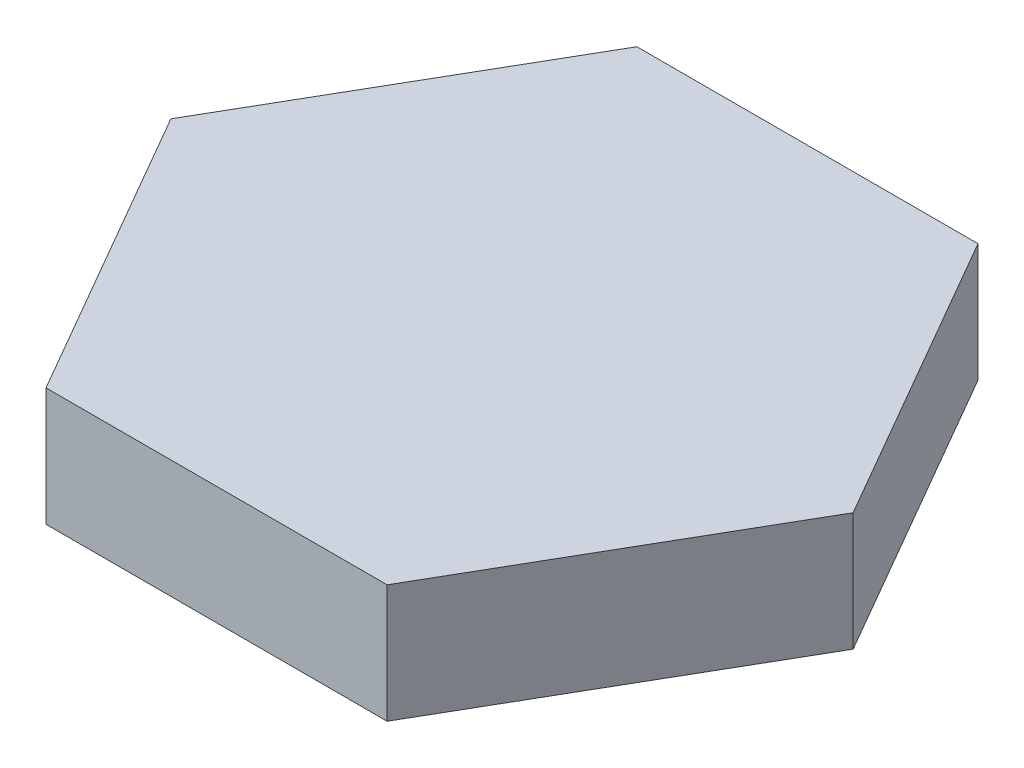
ISO-10303-21;
HEADER;
FILE_DESCRIPTION(('STEP AP214'),'2;1');
FILE_NAME('part.step','',(''),(''),'','','');
FILE_SCHEMA(('AUTOMOTIVE_DESIGN { 1 0 10303 214 1 1 1 1 }'));
ENDSEC;
DATA;
#1=APPLICATION_CONTEXT('core data for automotive mechanical design processes');
#2=APPLICATION_PROTOCOL_DEFINITION('international standard','automotive_design',2000,#1);
#3=PRODUCT_CONTEXT('',#1,'mechanical');
#4=PRODUCT('Part','Part','',(#3));
#5=PRODUCT_RELATED_PRODUCT_CATEGORY('part','',(#4));
#6=PRODUCT_DEFINITION_FORMATION('','',#4);
#7=PRODUCT_DEFINITION_CONTEXT('part definition',#1,'design');
#8=PRODUCT_DEFINITION('design','',#6,#7);
#9=PRODUCT_DEFINITION_SHAPE('','',#8);
#10=(LENGTH_UNIT() NAMED_UNIT(*) SI_UNIT(.MILLI.,.METRE.));
#11=(NAMED_UNIT(*) PLANE_ANGLE_UNIT() SI_UNIT($,.RADIAN.));
#12=(NAMED_UNIT(*) SI_UNIT($,.STERADIAN.) SOLID_ANGLE_UNIT());
#13=UNCERTAINTY_MEASURE_WITH_UNIT(LENGTH_MEASURE(1.E-05),#10,'distance_accuracy_value','');
#14=(GEOMETRIC_REPRESENTATION_CONTEXT(3) GLOBAL_UNCERTAINTY_ASSIGNED_CONTEXT((#13)) GLOBAL_UNIT_ASSIGNED_CONTEXT((#10,
#11,#12)) REPRESENTATION_CONTEXT('',''));
#15=CARTESIAN_POINT('',(0.,0.,0.));
#16=DIRECTION('',(0.,0.,1.));
#17=DIRECTION('',(1.,0.,0.));
#18=AXIS2_PLACEMENT_3D('',#15,#16,#17);
#19=CARTESIAN_POINT('',(57.7350269189626,10.,0.));
#20=DIRECTION('',(-0.866025403784438,0.,0.5));
#21=DIRECTION('',(0.5,0.,0.866025403784439));
#22=AXIS2_PLACEMENT_3D('',#19,#20,#21);
#23=PLANE('',#22);
#24=DIRECTION('',(-0.5,0.,-0.866025403784438));
#25=VECTOR('',#24,1.);
#26=CARTESIAN_POINT('',(57.7350269189626,-10.,0.));
#27=LINE('',#26,#25);
#28=CARTESIAN_POINT('',(57.7350269189626,-10.,0.));
#29=VERTEX_POINT('',#28);
#30=CARTESIAN_POINT('',(28.8675134594813,-10.,-50.));
#31=VERTEX_POINT('',#30);
#32=EDGE_CURVE('E119',#29,#31,#27,.T.);
#33=ORIENTED_EDGE('',*,*,#32,.T.);
#34=DIRECTION('',(0.,-1.,0.));
#35=VECTOR('',#34,1.);
#36=CARTESIAN_POINT('',(28.8675134594813,10.,-50.));
#37=LINE('',#36,#35);
#38=CARTESIAN_POINT('',(28.8675134594813,10.,-50.));
#39=VERTEX_POINT('',#38);
#40=EDGE_CURVE('E11',#39,#31,#37,.T.);
#41=ORIENTED_EDGE('',*,*,#40,.F.);
#42=DIRECTION('',(-0.5,0.,-0.866025403784438));
#43=VECTOR('',#42,1.);
#44=CARTESIAN_POINT('',(57.7350269189626,10.,0.));
#45=LINE('',#44,#43);
#46=CARTESIAN_POINT('',(57.7350269189626,10.,0.));
#47=VERTEX_POINT('',#46);
#48=EDGE_CURVE('E129',#47,#39,#45,.T.);
#49=ORIENTED_EDGE('',*,*,#48,.F.);
#50=DIRECTION('',(0.,-1.,0.));
#51=VECTOR('',#50,1.);
#52=CARTESIAN_POINT('',(57.7350269189626,10.,0.));
#53=LINE('',#52,#51);
#54=EDGE_CURVE('E115',#47,#29,#53,.T.);
#55=ORIENTED_EDGE('',*,*,#54,.T.);
#56=EDGE_LOOP('',(#33,#41,#49,#55));
#57=FACE_BOUND('',#56,.T.);
#58=ADVANCED_FACE('F35',(#57),#23,.F.);
#59=CARTESIAN_POINT('',(28.8675134594813,10.,-50.));
#60=DIRECTION('',(0.,0.,1.));
#61=DIRECTION('',(1.,0.,0.));
#62=AXIS2_PLACEMENT_3D('',#59,#60,#61);
#63=PLANE('',#62);
#64=DIRECTION('',(-1.,0.,0.));
#65=VECTOR('',#64,1.);
#66=CARTESIAN_POINT('',(28.8675134594813,-10.,-50.));
#67=LINE('',#66,#65);
#68=CARTESIAN_POINT('',(-28.8675134594813,-10.,-50.));
#69=VERTEX_POINT('',#68);
#70=EDGE_CURVE('E122',#31,#69,#67,.T.);
#71=ORIENTED_EDGE('',*,*,#70,.T.);
#72=DIRECTION('',(0.,-1.,0.));
#73=VECTOR('',#72,1.);
#74=CARTESIAN_POINT('',(-28.8675134594813,10.,-50.));
#75=LINE('',#74,#73);
#76=CARTESIAN_POINT('',(-28.8675134594813,10.,-50.));
#77=VERTEX_POINT('',#76);
#78=EDGE_CURVE('E43',#77,#69,#75,.T.);
#79=ORIENTED_EDGE('',*,*,#78,.F.);
#80=DIRECTION('',(-1.,0.,0.));
#81=VECTOR('',#80,1.);
#82=CARTESIAN_POINT('',(28.8675134594813,10.,-50.));
#83=LINE('',#82,#81);
#84=EDGE_CURVE('E88',#39,#77,#83,.T.);
#85=ORIENTED_EDGE('',*,*,#84,.F.);
#86=ORIENTED_EDGE('',*,*,#40,.T.);
#87=EDGE_LOOP('',(#71,#79,#85,#86));
#88=FACE_BOUND('',#87,.T.);
#89=ADVANCED_FACE('F153',(#88),#63,.F.);
#90=CARTESIAN_POINT('',(-28.8675134594813,10.,-50.));
#91=DIRECTION('',(0.866025403784439,0.,0.5));
#92=DIRECTION('',(0.5,0.,-0.866025403784439));
#93=AXIS2_PLACEMENT_3D('',#90,#91,#92);
#94=PLANE('',#93);
#95=DIRECTION('',(-0.5,0.,0.866025403784439));
#96=VECTOR('',#95,1.);
#97=CARTESIAN_POINT('',(-28.8675134594813,-10.,-50.));
#98=LINE('',#97,#96);
#99=CARTESIAN_POINT('',(-57.7350269189626,-10.,0.));
#100=VERTEX_POINT('',#99);
#101=EDGE_CURVE('E124',#69,#100,#98,.T.);
#102=ORIENTED_EDGE('',*,*,#101,.T.);
#103=DIRECTION('',(0.,-1.,0.));
#104=VECTOR('',#103,1.);
#105=CARTESIAN_POINT('',(-57.7350269189626,10.,0.));
#106=LINE('',#105,#104);
#107=CARTESIAN_POINT('',(-57.7350269189626,10.,0.));
#108=VERTEX_POINT('',#107);
#109=EDGE_CURVE('E110',#108,#100,#106,.T.);
#110=ORIENTED_EDGE('',*,*,#109,.F.);
#111=DIRECTION('',(-0.5,0.,0.866025403784439));
#112=VECTOR('',#111,1.);
#113=CARTESIAN_POINT('',(-28.8675134594813,10.,-50.));
#114=LINE('',#113,#112);
#115=EDGE_CURVE('E101',#77,#108,#114,.T.);
#116=ORIENTED_EDGE('',*,*,#115,.F.);
#117=ORIENTED_EDGE('',*,*,#78,.T.);
#118=EDGE_LOOP('',(#102,#110,#116,#117));
#119=FACE_BOUND('',#118,.T.);
#120=ADVANCED_FACE('F135',(#119),#94,.F.);
#121=CARTESIAN_POINT('',(-57.7350269189626,10.,0.));
#122=DIRECTION('',(0.866025403784438,0.,-0.5));
#123=DIRECTION('',(-0.5,0.,-0.866025403784439));
#124=AXIS2_PLACEMENT_3D('',#121,#122,#123);
#125=PLANE('',#124);
#126=DIRECTION('',(0.5,0.,0.866025403784438));
#127=VECTOR('',#126,1.);
#128=CARTESIAN_POINT('',(-57.7350269189626,-10.,0.));
#129=LINE('',#128,#127);
#130=CARTESIAN_POINT('',(-28.8675134594813,-10.,50.));
#131=VERTEX_POINT('',#130);
#132=EDGE_CURVE('E109',#100,#131,#129,.T.);
#133=ORIENTED_EDGE('',*,*,#132,.T.);
#134=DIRECTION('',(0.,-1.,0.));
#135=VECTOR('',#134,1.);
#136=CARTESIAN_POINT('',(-28.8675134594813,10.,50.));
#137=LINE('',#136,#135);
#138=CARTESIAN_POINT('',(-28.8675134594813,10.,50.));
#139=VERTEX_POINT('',#138);
#140=EDGE_CURVE('E106',#139,#131,#137,.T.);
#141=ORIENTED_EDGE('',*,*,#140,.F.);
#142=DIRECTION('',(0.5,0.,0.866025403784438));
#143=VECTOR('',#142,1.);
#144=CARTESIAN_POINT('',(-57.7350269189626,10.,0.));
#145=LINE('',#144,#143);
#146=EDGE_CURVE('E95',#108,#139,#145,.T.);
#147=ORIENTED_EDGE('',*,*,#146,.F.);
#148=ORIENTED_EDGE('',*,*,#109,.T.);
#149=EDGE_LOOP('',(#133,#141,#147,#148));
#150=FACE_BOUND('',#149,.T.);
#151=ADVANCED_FACE('F107',(#150),#125,.F.);
#152=CARTESIAN_POINT('',(-28.8675134594813,10.,50.));
#153=DIRECTION('',(0.,0.,-1.));
#154=DIRECTION('',(-1.,0.,0.));
#155=AXIS2_PLACEMENT_3D('',#152,#153,#154);
#156=PLANE('',#155);
#157=DIRECTION('',(1.,0.,0.));
#158=VECTOR('',#157,1.);
#159=CARTESIAN_POINT('',(-28.8675134594813,-10.,50.));
#160=LINE('',#159,#158);
#161=CARTESIAN_POINT('',(28.8675134594813,-10.,50.));
#162=VERTEX_POINT('',#161);
#163=EDGE_CURVE('E74',#131,#162,#160,.T.);
#164=ORIENTED_EDGE('',*,*,#163,.T.);
#165=DIRECTION('',(0.,-1.,0.));
#166=VECTOR('',#165,1.);
#167=CARTESIAN_POINT('',(28.8675134594813,10.,50.));
#168=LINE('',#167,#166);
#169=CARTESIAN_POINT('',(28.8675134594813,10.,50.));
#170=VERTEX_POINT('',#169);
#171=EDGE_CURVE('E111',#170,#162,#168,.T.);
#172=ORIENTED_EDGE('',*,*,#171,.F.);
#173=DIRECTION('',(1.,0.,0.));
#174=VECTOR('',#173,1.);
#175=CARTESIAN_POINT('',(-28.8675134594813,10.,50.));
#176=LINE('',#175,#174);
#177=EDGE_CURVE('E99',#139,#170,#176,.T.);
#178=ORIENTED_EDGE('',*,*,#177,.F.);
#179=ORIENTED_EDGE('',*,*,#140,.T.);
#180=EDGE_LOOP('',(#164,#172,#178,#179));
#181=FACE_BOUND('',#180,.T.);
#182=ADVANCED_FACE('F113',(#181),#156,.F.);
#183=CARTESIAN_POINT('',(28.8675134594813,10.,50.));
#184=DIRECTION('',(-0.866025403784439,0.,-0.5));
#185=DIRECTION('',(-0.5,0.,0.866025403784439));
#186=AXIS2_PLACEMENT_3D('',#183,#184,#185);
#187=PLANE('',#186);
#188=DIRECTION('',(0.5,0.,-0.866025403784439));
#189=VECTOR('',#188,1.);
#190=CARTESIAN_POINT('',(28.8675134594813,-10.,50.));
#191=LINE('',#190,#189);
#192=EDGE_CURVE('E80',#162,#29,#191,.T.);
#193=ORIENTED_EDGE('',*,*,#192,.T.);
#194=ORIENTED_EDGE('',*,*,#54,.F.);
#195=DIRECTION('',(0.5,0.,-0.866025403784439));
#196=VECTOR('',#195,1.);
#197=CARTESIAN_POINT('',(28.8675134594813,10.,50.));
#198=LINE('',#197,#196);
#199=EDGE_CURVE('E51',#170,#47,#198,.T.);
#200=ORIENTED_EDGE('',*,*,#199,.F.);
#201=ORIENTED_EDGE('',*,*,#171,.T.);
#202=EDGE_LOOP('',(#193,#194,#200,#201));
#203=FACE_BOUND('',#202,.T.);
#204=ADVANCED_FACE('F142',(#203),#187,.F.);
#205=CARTESIAN_POINT('',(0.,10.,0.));
#206=DIRECTION('',(0.,1.,0.));
#207=DIRECTION('',(0.,0.,1.));
#208=AXIS2_PLACEMENT_3D('',#205,#206,#207);
#209=PLANE('',#208);
#210=ORIENTED_EDGE('',*,*,#48,.T.);
#211=ORIENTED_EDGE('',*,*,#84,.T.);
#212=ORIENTED_EDGE('',*,*,#115,.T.);
#213=ORIENTED_EDGE('',*,*,#146,.T.);
#214=ORIENTED_EDGE('',*,*,#177,.T.);
#215=ORIENTED_EDGE('',*,*,#199,.T.);
#216=EDGE_LOOP('',(#210,#211,#212,#213,#214,#215));
#217=FACE_BOUND('',#216,.T.);
#218=ADVANCED_FACE('F97',(#217),#209,.T.);
#219=CARTESIAN_POINT('',(0.,-10.,0.));
#220=DIRECTION('',(0.,1.,0.));
#221=DIRECTION('',(0.,0.,1.));
#222=AXIS2_PLACEMENT_3D('',#219,#220,#221);
#223=PLANE('',#222);
#224=ORIENTED_EDGE('',*,*,#32,.F.);
#225=ORIENTED_EDGE('',*,*,#192,.F.);
#226=ORIENTED_EDGE('',*,*,#163,.F.);
#227=ORIENTED_EDGE('',*,*,#132,.F.);
#228=ORIENTED_EDGE('',*,*,#101,.F.);
#229=ORIENTED_EDGE('',*,*,#70,.F.);
#230=EDGE_LOOP('',(#224,#225,#226,#227,#228,#229));
#231=FACE_BOUND('',#230,.T.);
#232=ADVANCED_FACE('F138',(#231),#223,.F.);
#233=CLOSED_SHELL('',(#58,#89,#120,#151,#182,#204,#218,#232));
#234=MANIFOLD_SOLID_BREP('B2',#233);
#235=ADVANCED_BREP_SHAPE_REPRESENTATION('',(#18,#234),#14);
#236=SHAPE_DEFINITION_REPRESENTATION(#9,#235);
ENDSEC;
END-ISO-10303-21;
